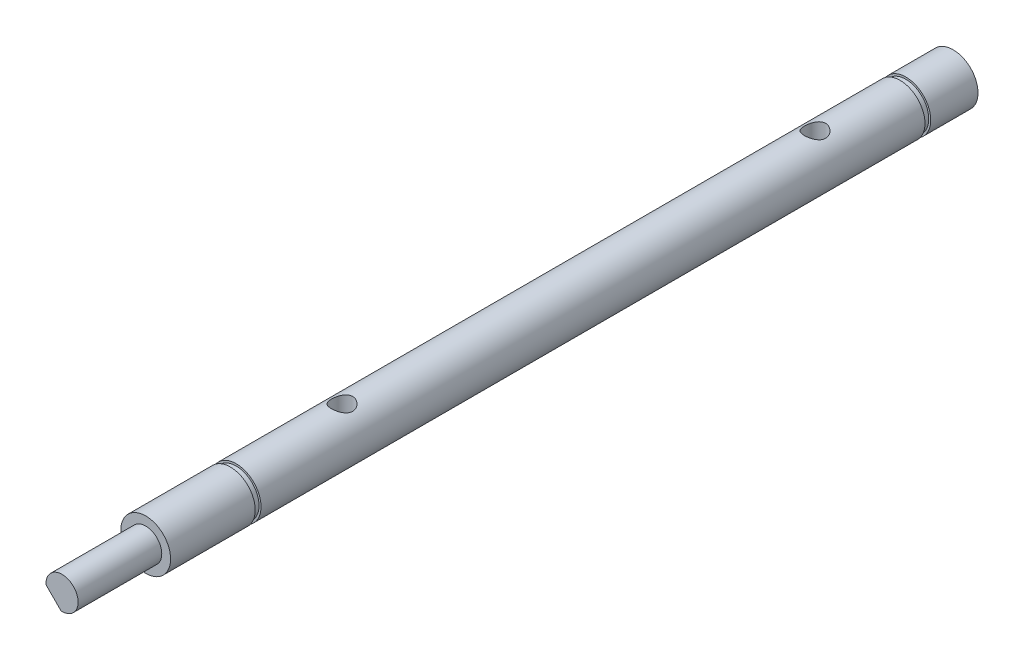
ISO-10303-21;
HEADER;
FILE_DESCRIPTION(('STEP AP214'),'2;1');
FILE_NAME('part.step','',(''),(''),'','','');
FILE_SCHEMA(('AUTOMOTIVE_DESIGN { 1 0 10303 214 1 1 1 1 }'));
ENDSEC;
DATA;
#1=APPLICATION_CONTEXT('core data for automotive mechanical design processes');
#2=APPLICATION_PROTOCOL_DEFINITION('international standard','automotive_design',2000,#1);
#3=PRODUCT_CONTEXT('',#1,'mechanical');
#4=PRODUCT('Part','Part','',(#3));
#5=PRODUCT_RELATED_PRODUCT_CATEGORY('part','',(#4));
#6=PRODUCT_DEFINITION_FORMATION('','',#4);
#7=PRODUCT_DEFINITION_CONTEXT('part definition',#1,'design');
#8=PRODUCT_DEFINITION('design','',#6,#7);
#9=PRODUCT_DEFINITION_SHAPE('','',#8);
#10=(LENGTH_UNIT() NAMED_UNIT(*) SI_UNIT(.MILLI.,.METRE.));
#11=(NAMED_UNIT(*) PLANE_ANGLE_UNIT() SI_UNIT($,.RADIAN.));
#12=(NAMED_UNIT(*) SI_UNIT($,.STERADIAN.) SOLID_ANGLE_UNIT());
#13=UNCERTAINTY_MEASURE_WITH_UNIT(LENGTH_MEASURE(1.E-05),#10,'distance_accuracy_value','');
#14=(GEOMETRIC_REPRESENTATION_CONTEXT(3) GLOBAL_UNCERTAINTY_ASSIGNED_CONTEXT((#13)) GLOBAL_UNIT_ASSIGNED_CONTEXT((#10,
#11,#12)) REPRESENTATION_CONTEXT('',''));
#15=CARTESIAN_POINT('',(0.,0.,0.));
#16=DIRECTION('',(0.,0.,1.));
#17=DIRECTION('',(1.,0.,0.));
#18=AXIS2_PLACEMENT_3D('',#15,#16,#17);
#19=CARTESIAN_POINT('',(-35.5331378268646,0.,13.843));
#20=DIRECTION('',(0.,0.,1.));
#21=DIRECTION('',(1.,0.,0.));
#22=AXIS2_PLACEMENT_3D('',#19,#20,#21);
#23=CYLINDRICAL_SURFACE('',#22,3.175);
#24=CARTESIAN_POINT('',(-35.5331378268646,-3.17500000000001,-83.5361541101905));
#25=CARTESIAN_POINT('',(-35.4608258465463,-3.17499376427411,-83.5361458853937));
#26=CARTESIAN_POINT('',(-35.3884074708951,-3.17250122265996,-83.5303208810433));
#27=CARTESIAN_POINT('',(-35.2456295737952,-3.16277066799622,-83.5072311196538));
#28=CARTESIAN_POINT('',(-35.1752757657073,-3.15552058505164,-83.4899372649224));
#29=CARTESIAN_POINT('',(-35.0389288869422,-3.13705242394938,-83.4446706315388));
#30=CARTESIAN_POINT('',(-34.9729216851781,-3.12584804282756,-83.4167346891297));
#31=CARTESIAN_POINT('',(-34.8465970192275,-3.1005551810215,-83.3511324234816));
#32=CARTESIAN_POINT('',(-34.7862779804942,-3.0864675019097,-83.3134688038288));
#33=CARTESIAN_POINT('',(-34.669807205311,-3.05599084668588,-83.2274146325406));
#34=CARTESIAN_POINT('',(-34.6139897838708,-3.03952431771545,-83.1785993328251));
#35=CARTESIAN_POINT('',(-34.5110440271247,-3.00647271455962,-83.0725266464288));
#36=CARTESIAN_POINT('',(-34.4639204609107,-2.98988758046311,-83.0152646570495));
#37=CARTESIAN_POINT('',(-34.3772759403605,-2.95750917471473,-82.890320255909));
#38=CARTESIAN_POINT('',(-34.3382773780979,-2.94180185247632,-82.8222509493234));
#39=CARTESIAN_POINT('',(-34.2724328289807,-2.91419493098839,-82.6797543259549));
#40=CARTESIAN_POINT('',(-34.245580303087,-2.90229328389849,-82.6053304559847));
#41=CARTESIAN_POINT('',(-34.2061864551322,-2.88448854081884,-82.4560858922888));
#42=CARTESIAN_POINT('',(-34.1930001610563,-2.87831670118837,-82.3814687766833));
#43=CARTESIAN_POINT('',(-34.1793027701837,-2.87190163928983,-82.2308455212675));
#44=CARTESIAN_POINT('',(-34.1787842195909,-2.87165493063135,-82.1548402246248));
#45=CARTESIAN_POINT('',(-34.1899528680395,-2.87689162283201,-82.0101605723525));
#46=CARTESIAN_POINT('',(-34.2006569549422,-2.88191351336427,-81.9413901994606));
#47=CARTESIAN_POINT('',(-34.2323123386599,-2.89633861211709,-81.8067351310634));
#48=CARTESIAN_POINT('',(-34.2532657046312,-2.9057427050121,-81.7408510211734));
#49=CARTESIAN_POINT('',(-34.3052369531808,-2.92808748949867,-81.6121368326237));
#50=CARTESIAN_POINT('',(-34.3364635049763,-2.94110054344016,-81.5494041384309));
#51=CARTESIAN_POINT('',(-34.4079464487757,-2.96918199373292,-81.4298178843847));
#52=CARTESIAN_POINT('',(-34.4482064891825,-2.98425121955487,-81.3729667135256));
#53=CARTESIAN_POINT('',(-34.5408038769364,-3.01637253593643,-81.2614482236268));
#54=CARTESIAN_POINT('',(-34.5938958318252,-3.0334819320518,-81.2074221580887));
#55=CARTESIAN_POINT('',(-34.7085479876994,-3.06663259637419,-81.1088196385918));
#56=CARTESIAN_POINT('',(-34.7701103477964,-3.08267359069276,-81.0642456013462));
#57=CARTESIAN_POINT('',(-34.9019798282604,-3.11238486879189,-80.9848132928089));
#58=CARTESIAN_POINT('',(-34.9724677623041,-3.12598548270222,-80.9502271915684));
#59=CARTESIAN_POINT('',(-35.1189892299383,-3.14874388156017,-80.8936311526974));
#60=CARTESIAN_POINT('',(-35.1950195274191,-3.15790423558694,-80.8716139415496));
#61=CARTESIAN_POINT('',(-35.3451183745293,-3.17026332558043,-80.8421490295315));
#62=CARTESIAN_POINT('',(-35.4189892089949,-3.17381325962292,-80.833841454889));
#63=CARTESIAN_POINT('',(-35.5671492550794,-3.17568105366637,-80.8294540369906));
#64=CARTESIAN_POINT('',(-35.6414383327188,-3.17400050350427,-80.8333704781729));
#65=CARTESIAN_POINT('',(-35.78422419281,-3.16582243599865,-80.8527145501664));
#66=CARTESIAN_POINT('',(-35.8528205452816,-3.15958185757468,-80.867528442903));
#67=CARTESIAN_POINT('',(-35.9864729421111,-3.14319082038793,-80.9073816774549));
#68=CARTESIAN_POINT('',(-36.0515285432473,-3.13303987341454,-80.9324222961032));
#69=CARTESIAN_POINT('',(-36.1785486189836,-3.10940117061925,-80.9928324368617));
#70=CARTESIAN_POINT('',(-36.240353286235,-3.0958191739096,-81.0284998899359));
#71=CARTESIAN_POINT('',(-36.3573227066593,-3.06675439613932,-81.1088251462745));
#72=CARTESIAN_POINT('',(-36.412484621555,-3.05127080824472,-81.1534867708905));
#73=CARTESIAN_POINT('',(-36.5189286055891,-3.01863676563667,-81.2544217129391));
#74=CARTESIAN_POINT('',(-36.569615057641,-3.00144808863403,-81.3113123846377));
#75=CARTESIAN_POINT('',(-36.6608990537127,-2.96835692538156,-81.4330471338792));
#76=CARTESIAN_POINT('',(-36.7014939080959,-2.95245478278206,-81.4978933248829));
#77=CARTESIAN_POINT('',(-36.7719959554591,-2.92358303045919,-81.6352616842834));
#78=CARTESIAN_POINT('',(-36.8017083479671,-2.91066826625578,-81.7078962275471));
#79=CARTESIAN_POINT('',(-36.8482171068941,-2.88995701757538,-81.8578634695168));
#80=CARTESIAN_POINT('',(-36.865024777199,-2.88215605454429,-81.9351919923063));
#81=CARTESIAN_POINT('',(-36.8840999877546,-2.87326066425686,-82.0857130937064));
#82=CARTESIAN_POINT('',(-36.8874194967548,-2.87168133184629,-82.1587441892723));
#83=CARTESIAN_POINT('',(-36.8822584965445,-2.87410980516819,-82.304285747412));
#84=CARTESIAN_POINT('',(-36.8737800065305,-2.8781166548405,-82.3767962969411));
#85=CARTESIAN_POINT('',(-36.8461603791058,-2.89081435572086,-82.5154285504303));
#86=CARTESIAN_POINT('',(-36.8275833429974,-2.89925667251006,-82.5816876365108));
#87=CARTESIAN_POINT('',(-36.7808595776859,-2.91966810669132,-82.710156511446));
#88=CARTESIAN_POINT('',(-36.7527101345619,-2.93163822413925,-82.7723651459711));
#89=CARTESIAN_POINT('',(-36.68564819358,-2.95866974170817,-82.8951535661335));
#90=CARTESIAN_POINT('',(-36.6461796054681,-2.9738761215368,-82.9553970865907));
#91=CARTESIAN_POINT('',(-36.5583595018584,-3.00528179589944,-83.06873461292));
#92=CARTESIAN_POINT('',(-36.5100046871307,-3.02148145772031,-83.1218259506387));
#93=CARTESIAN_POINT('',(-36.4013376869132,-3.05455722211636,-83.2235949357091));
#94=CARTESIAN_POINT('',(-36.3403889230099,-3.07138832065965,-83.2716107536678));
#95=CARTESIAN_POINT('',(-36.2106848598122,-3.10257916482517,-83.3567786895932));
#96=CARTESIAN_POINT('',(-36.1419260393688,-3.11693778833813,-83.3939258802558));
#97=CARTESIAN_POINT('',(-35.9994870715847,-3.14138312017249,-83.45554879584));
#98=CARTESIAN_POINT('',(-35.9258964286999,-3.15153079407948,-83.480206588307));
#99=CARTESIAN_POINT('',(-35.7752161107187,-3.16665584269732,-83.5165545078877));
#100=CARTESIAN_POINT('',(-35.6981380843486,-3.17164926980854,-83.5282849038896));
#101=CARTESIAN_POINT('',(-35.5915391547414,-3.17459936321147,-83.5352116684735));
#102=CARTESIAN_POINT('',(-35.562347170722,-3.1750025188283,-83.5361574324743));
#103=CARTESIAN_POINT('',(-35.5331378268646,-3.17500000000001,-83.5361541101905));
#104=B_SPLINE_CURVE_WITH_KNOTS('',3,(#24,#25,#26,#27,#28,#29,#30,#31,#32,#33,#34,#35,#36,#37,
#38,#39,#40,#41,#42,#43,#44,#45,#46,#47,#48,#49,#50,#51,#52,#53,#54,#55,#56,#57,#58,#59,#60,#61,
#62,#63,#64,#65,#66,#67,#68,#69,#70,#71,#72,#73,#74,#75,#76,#77,#78,#79,#80,#81,#82,#83,#84,#85,
#86,#87,#88,#89,#90,#91,#92,#93,#94,#95,#96,#97,#98,#99,#100,#101,#102,#103),.UNSPECIFIED.,.T.,
.F.,(4,2,2,2,2,2,2,2,2,2,2,2,2,2,2,2,2,2,2,2,2,2,2,2,2,2,2,2,2,2,2,2,2,2,2,2,2,2,2,4),(0.,
0.216850050638948,0.434252388523417,0.650908954368244,0.867505370130757,1.09439609589245,
1.32141091689532,1.56022386511507,1.79890809057365,2.02572902648838,2.25241649603317,
2.46078251280766,2.66919061253202,2.88212426261051,3.09514406662219,3.32706321416166,
3.55904158793931,3.79684693152946,4.03451451918153,4.25661426582134,4.47864651050856,
4.68904802527594,4.89947581724861,5.11647002970504,5.33355663169251,5.56682347195768,
5.80015241655902,6.03747459229674,6.27458864785541,6.49280702774576,6.71098806472668,
6.91807492424943,7.12522054501708,7.34512352029498,7.56510830550798,7.80215736760158,
8.03931373022254,8.27290548905707,8.5057675337372,8.59336087119989),.UNSPECIFIED.);
#105=CARTESIAN_POINT('',(-35.5331378268646,-3.17500000000001,-83.5361541101905));
#106=VERTEX_POINT('',#105);
#107=EDGE_CURVE('E11',#106,#106,#104,.T.);
#108=ORIENTED_EDGE('',*,*,#107,.F.);
#109=EDGE_LOOP('',(#108));
#110=FACE_BOUND('',#109,.T.);
#111=CARTESIAN_POINT('',(-35.5331378268646,3.175,-83.5361541101905));
#112=CARTESIAN_POINT('',(-35.6054498071829,3.17499376427411,-83.5361458853937));
#113=CARTESIAN_POINT('',(-35.677868182834,3.17250122265996,-83.5303208810433));
#114=CARTESIAN_POINT('',(-35.8206460799339,3.16277066799622,-83.5072311196538));
#115=CARTESIAN_POINT('',(-35.8909998880218,3.15552058505164,-83.4899372649224));
#116=CARTESIAN_POINT('',(-36.0273467667869,3.13705242394938,-83.4446706315388));
#117=CARTESIAN_POINT('',(-36.093353968551,3.12584804282756,-83.4167346891297));
#118=CARTESIAN_POINT('',(-36.2196786345016,3.1005551810215,-83.3511324234816));
#119=CARTESIAN_POINT('',(-36.2799976732349,3.0864675019097,-83.3134688038288));
#120=CARTESIAN_POINT('',(-36.3964684484181,3.05599084668588,-83.2274146325406));
#121=CARTESIAN_POINT('',(-36.4522858698583,3.03952431771545,-83.1785993328251));
#122=CARTESIAN_POINT('',(-36.5552316266044,3.00647271455962,-83.0725266464288));
#123=CARTESIAN_POINT('',(-36.6023551928184,2.98988758046311,-83.0152646570495));
#124=CARTESIAN_POINT('',(-36.6889997133686,2.95750917471473,-82.890320255909));
#125=CARTESIAN_POINT('',(-36.7279982756312,2.94180185247632,-82.8222509493234));
#126=CARTESIAN_POINT('',(-36.7938428247484,2.91419493098839,-82.6797543259549));
#127=CARTESIAN_POINT('',(-36.8206953506421,2.90229328389849,-82.6053304559847));
#128=CARTESIAN_POINT('',(-36.8600891985969,2.88448854081884,-82.4560858922888));
#129=CARTESIAN_POINT('',(-36.8732754926728,2.87831670118837,-82.3814687766833));
#130=CARTESIAN_POINT('',(-36.8869728835454,2.87190163928983,-82.2308455212675));
#131=CARTESIAN_POINT('',(-36.8874914341382,2.87165493063135,-82.1548402246248));
#132=CARTESIAN_POINT('',(-36.8763227856896,2.87689162283201,-82.0101605723525));
#133=CARTESIAN_POINT('',(-36.8656186987869,2.88191351336427,-81.9413901994606));
#134=CARTESIAN_POINT('',(-36.8339633150692,2.89633861211709,-81.8067351310634));
#135=CARTESIAN_POINT('',(-36.8130099490979,2.9057427050121,-81.7408510211734));
#136=CARTESIAN_POINT('',(-36.7610387005483,2.92808748949867,-81.6121368326237));
#137=CARTESIAN_POINT('',(-36.7298121487528,2.94110054344016,-81.5494041384309));
#138=CARTESIAN_POINT('',(-36.6583292049534,2.96918199373292,-81.4298178843847));
#139=CARTESIAN_POINT('',(-36.6180691645466,2.98425121955487,-81.3729667135256));
#140=CARTESIAN_POINT('',(-36.5254717767927,3.01637253593643,-81.2614482236268));
#141=CARTESIAN_POINT('',(-36.4723798219039,3.0334819320518,-81.2074221580887));
#142=CARTESIAN_POINT('',(-36.3577276660297,3.06663259637419,-81.1088196385918));
#143=CARTESIAN_POINT('',(-36.2961653059327,3.08267359069276,-81.0642456013462));
#144=CARTESIAN_POINT('',(-36.1642958254687,3.11238486879189,-80.9848132928089));
#145=CARTESIAN_POINT('',(-36.093807891425,3.12598548270222,-80.9502271915684));
#146=CARTESIAN_POINT('',(-35.9472864237909,3.14874388156017,-80.8936311526974));
#147=CARTESIAN_POINT('',(-35.87125612631,3.15790423558694,-80.8716139415496));
#148=CARTESIAN_POINT('',(-35.7211572791999,3.17026332558043,-80.8421490295315));
#149=CARTESIAN_POINT('',(-35.6472864447342,3.17381325962292,-80.833841454889));
#150=CARTESIAN_POINT('',(-35.4991263986497,3.17568105366637,-80.8294540369906));
#151=CARTESIAN_POINT('',(-35.4248373210103,3.17400050350427,-80.8333704781729));
#152=CARTESIAN_POINT('',(-35.2820514609191,3.16582243599865,-80.8527145501664));
#153=CARTESIAN_POINT('',(-35.2134551084475,3.15958185757468,-80.867528442903));
#154=CARTESIAN_POINT('',(-35.079802711618,3.14319082038793,-80.9073816774549));
#155=CARTESIAN_POINT('',(-35.0147471104818,3.13303987341454,-80.9324222961032));
#156=CARTESIAN_POINT('',(-34.8877270347456,3.10940117061925,-80.9928324368617));
#157=CARTESIAN_POINT('',(-34.8259223674941,3.0958191739096,-81.0284998899359));
#158=CARTESIAN_POINT('',(-34.7089529470698,3.06675439613932,-81.1088251462745));
#159=CARTESIAN_POINT('',(-34.6537910321741,3.05127080824472,-81.1534867708905));
#160=CARTESIAN_POINT('',(-34.54734704814,3.01863676563667,-81.2544217129391));
#161=CARTESIAN_POINT('',(-34.4966605960881,3.00144808863403,-81.3113123846377));
#162=CARTESIAN_POINT('',(-34.4053766000164,2.96835692538156,-81.4330471338792));
#163=CARTESIAN_POINT('',(-34.3647817456332,2.95245478278206,-81.4978933248829));
#164=CARTESIAN_POINT('',(-34.29427969827,2.92358303045919,-81.6352616842834));
#165=CARTESIAN_POINT('',(-34.264567305762,2.91066826625578,-81.7078962275471));
#166=CARTESIAN_POINT('',(-34.218058546835,2.88995701757538,-81.8578634695168));
#167=CARTESIAN_POINT('',(-34.2012508765301,2.88215605454429,-81.9351919923063));
#168=CARTESIAN_POINT('',(-34.1821756659745,2.87326066425686,-82.0857130937064));
#169=CARTESIAN_POINT('',(-34.1788561569743,2.87168133184629,-82.1587441892723));
#170=CARTESIAN_POINT('',(-34.1840171571846,2.87410980516819,-82.304285747412));
#171=CARTESIAN_POINT('',(-34.1924956471986,2.8781166548405,-82.3767962969411));
#172=CARTESIAN_POINT('',(-34.2201152746233,2.89081435572086,-82.5154285504303));
#173=CARTESIAN_POINT('',(-34.2386923107317,2.89925667251006,-82.5816876365108));
#174=CARTESIAN_POINT('',(-34.2854160760432,2.91966810669132,-82.710156511446));
#175=CARTESIAN_POINT('',(-34.3135655191672,2.93163822413925,-82.7723651459711));
#176=CARTESIAN_POINT('',(-34.3806274601491,2.95866974170817,-82.8951535661335));
#177=CARTESIAN_POINT('',(-34.420096048261,2.9738761215368,-82.9553970865907));
#178=CARTESIAN_POINT('',(-34.5079161518707,3.00528179589944,-83.06873461292));
#179=CARTESIAN_POINT('',(-34.5562709665985,3.02148145772031,-83.1218259506387));
#180=CARTESIAN_POINT('',(-34.6649379668159,3.05455722211636,-83.2235949357091));
#181=CARTESIAN_POINT('',(-34.7258867307192,3.07138832065965,-83.2716107536678));
#182=CARTESIAN_POINT('',(-34.8555907939169,3.10257916482517,-83.3567786895932));
#183=CARTESIAN_POINT('',(-34.9243496143603,3.11693778833813,-83.3939258802558));
#184=CARTESIAN_POINT('',(-35.0667885821444,3.14138312017248,-83.45554879584));
#185=CARTESIAN_POINT('',(-35.1403792250292,3.15153079407948,-83.480206588307));
#186=CARTESIAN_POINT('',(-35.2910595430104,3.16665584269732,-83.5165545078877));
#187=CARTESIAN_POINT('',(-35.3681375693805,3.17164926980854,-83.5282849038896));
#188=CARTESIAN_POINT('',(-35.4747364989878,3.17459936321147,-83.5352116684735));
#189=CARTESIAN_POINT('',(-35.5039284830071,3.1750025188283,-83.5361574324743));
#190=CARTESIAN_POINT('',(-35.5331378268646,3.175,-83.5361541101905));
#191=B_SPLINE_CURVE_WITH_KNOTS('',3,(#111,#112,#113,#114,#115,#116,#117,#118,#119,#120,#121,
#122,#123,#124,#125,#126,#127,#128,#129,#130,#131,#132,#133,#134,#135,#136,#137,#138,#139,#140,
#141,#142,#143,#144,#145,#146,#147,#148,#149,#150,#151,#152,#153,#154,#155,#156,#157,#158,#159,
#160,#161,#162,#163,#164,#165,#166,#167,#168,#169,#170,#171,#172,#173,#174,#175,#176,#177,#178,
#179,#180,#181,#182,#183,#184,#185,#186,#187,#188,#189,#190),.UNSPECIFIED.,.T.,.F.,(4,2,2,2,2,2,
2,2,2,2,2,2,2,2,2,2,2,2,2,2,2,2,2,2,2,2,2,2,2,2,2,2,2,2,2,2,2,2,2,4),(0.,0.216850050638948,
0.434252388523417,0.650908954368244,0.867505370130757,1.09439609589245,1.32141091689532,
1.56022386511507,1.79890809057365,2.02572902648838,2.25241649603317,2.46078251280766,
2.66919061253202,2.88212426261051,3.09514406662219,3.32706321416166,3.55904158793931,
3.79684693152946,4.03451451918153,4.25661426582134,4.47864651050856,4.68904802527594,
4.89947581724861,5.11647002970504,5.33355663169251,5.56682347195768,5.80015241655902,
6.03747459229674,6.27458864785541,6.49280702774576,6.71098806472668,6.91807492424943,
7.12522054501708,7.34512352029498,7.56510830550798,7.80215736760158,8.03931373022254,
8.27290548905706,8.5057675337372,8.59336087119988),.UNSPECIFIED.);
#192=CARTESIAN_POINT('',(-35.5331378268646,3.175,-83.5361541101905));
#193=VERTEX_POINT('',#192);
#194=EDGE_CURVE('E77',#193,#193,#191,.T.);
#195=ORIENTED_EDGE('',*,*,#194,.F.);
#196=EDGE_LOOP('',(#195));
#197=FACE_BOUND('',#196,.T.);
#198=CARTESIAN_POINT('',(-35.5331378268646,-3.17500000000001,-23.2111541101903));
#199=CARTESIAN_POINT('',(-35.4608258465463,-3.17499376427411,-23.2111458853935));
#200=CARTESIAN_POINT('',(-35.3884074708951,-3.17250122265996,-23.2053208810431));
#201=CARTESIAN_POINT('',(-35.2456295737952,-3.16277066799622,-23.1822311196536));
#202=CARTESIAN_POINT('',(-35.1752757657073,-3.15552058505164,-23.1649372649222));
#203=CARTESIAN_POINT('',(-35.0389288869422,-3.13705242394938,-23.1196706315386));
#204=CARTESIAN_POINT('',(-34.9729216851781,-3.12584804282756,-23.0917346891296));
#205=CARTESIAN_POINT('',(-34.8465970192275,-3.1005551810215,-23.0261324234814));
#206=CARTESIAN_POINT('',(-34.7862779804942,-3.0864675019097,-22.9884688038286));
#207=CARTESIAN_POINT('',(-34.669807205311,-3.05599084668588,-22.9024146325404));
#208=CARTESIAN_POINT('',(-34.6139897838708,-3.03952431771545,-22.8535993328249));
#209=CARTESIAN_POINT('',(-34.5110440271247,-3.00647271455962,-22.7475266464286));
#210=CARTESIAN_POINT('',(-34.4639204609107,-2.98988758046312,-22.6902646570493));
#211=CARTESIAN_POINT('',(-34.3772759403605,-2.95750917471473,-22.5653202559089));
#212=CARTESIAN_POINT('',(-34.3382773780979,-2.94180185247633,-22.4972509493232));
#213=CARTESIAN_POINT('',(-34.2724328289807,-2.91419493098839,-22.3547543259548));
#214=CARTESIAN_POINT('',(-34.245580303087,-2.90229328389849,-22.2803304559845));
#215=CARTESIAN_POINT('',(-34.2061864551322,-2.88448854081884,-22.1310858922886));
#216=CARTESIAN_POINT('',(-34.1930001610563,-2.87831670118837,-22.0564687766831));
#217=CARTESIAN_POINT('',(-34.1793027701837,-2.87190163928982,-21.9058455212673));
#218=CARTESIAN_POINT('',(-34.1787842195909,-2.87165493063134,-21.8298402246246));
#219=CARTESIAN_POINT('',(-34.1899528680395,-2.876891622832,-21.6851605723523));
#220=CARTESIAN_POINT('',(-34.2006569549422,-2.88191351336426,-21.6163901994604));
#221=CARTESIAN_POINT('',(-34.2323123386599,-2.89633861211709,-21.4817351310633));
#222=CARTESIAN_POINT('',(-34.2532657046312,-2.9057427050121,-21.4158510211733));
#223=CARTESIAN_POINT('',(-34.3052369531808,-2.92808748949866,-21.2871368326235));
#224=CARTESIAN_POINT('',(-34.3364635049763,-2.94110054344015,-21.2244041384308));
#225=CARTESIAN_POINT('',(-34.4079464487757,-2.96918199373291,-21.1048178843845));
#226=CARTESIAN_POINT('',(-34.4482064891825,-2.98425121955487,-21.0479667135254));
#227=CARTESIAN_POINT('',(-34.5408038769364,-3.01637253593643,-20.9364482236266));
#228=CARTESIAN_POINT('',(-34.5938958318252,-3.0334819320518,-20.8824221580885));
#229=CARTESIAN_POINT('',(-34.7085479876994,-3.06663259637418,-20.7838196385916));
#230=CARTESIAN_POINT('',(-34.7701103477964,-3.08267359069276,-20.739245601346));
#231=CARTESIAN_POINT('',(-34.9019798282604,-3.11238486879189,-20.6598132928087));
#232=CARTESIAN_POINT('',(-34.9724677623041,-3.12598548270222,-20.6252271915682));
#233=CARTESIAN_POINT('',(-35.1189892299382,-3.14874388156017,-20.5686311526972));
#234=CARTESIAN_POINT('',(-35.1950195274191,-3.15790423558693,-20.5466139415494));
#235=CARTESIAN_POINT('',(-35.3451183745292,-3.17026332558043,-20.5171490295313));
#236=CARTESIAN_POINT('',(-35.4189892089949,-3.17381325962292,-20.5088414548889));
#237=CARTESIAN_POINT('',(-35.5671492550794,-3.17568105366637,-20.5044540369904));
#238=CARTESIAN_POINT('',(-35.6414383327188,-3.17400050350427,-20.5083704781727));
#239=CARTESIAN_POINT('',(-35.78422419281,-3.16582243599865,-20.5277145501662));
#240=CARTESIAN_POINT('',(-35.8528205452816,-3.15958185757468,-20.5425284429029));
#241=CARTESIAN_POINT('',(-35.9864729421111,-3.14319082038793,-20.5823816774547));
#242=CARTESIAN_POINT('',(-36.0515285432473,-3.13303987341455,-20.607422296103));
#243=CARTESIAN_POINT('',(-36.1785486189835,-3.10940117061926,-20.6678324368615));
#244=CARTESIAN_POINT('',(-36.240353286235,-3.0958191739096,-20.7034998899357));
#245=CARTESIAN_POINT('',(-36.3573227066593,-3.06675439613932,-20.7838251462743));
#246=CARTESIAN_POINT('',(-36.412484621555,-3.05127080824472,-20.8284867708903));
#247=CARTESIAN_POINT('',(-36.5189286055891,-3.01863676563667,-20.9294217129389));
#248=CARTESIAN_POINT('',(-36.569615057641,-3.00144808863403,-20.9863123846375));
#249=CARTESIAN_POINT('',(-36.6608990537127,-2.96835692538156,-21.108047133879));
#250=CARTESIAN_POINT('',(-36.7014939080959,-2.95245478278207,-21.1728933248827));
#251=CARTESIAN_POINT('',(-36.7719959554591,-2.92358303045919,-21.3102616842832));
#252=CARTESIAN_POINT('',(-36.8017083479671,-2.91066826625579,-21.3828962275469));
#253=CARTESIAN_POINT('',(-36.8482171068941,-2.88995701757538,-21.5328634695166));
#254=CARTESIAN_POINT('',(-36.865024777199,-2.88215605454429,-21.6101919923061));
#255=CARTESIAN_POINT('',(-36.8840999877546,-2.87326066425686,-21.7607130937063));
#256=CARTESIAN_POINT('',(-36.8874194967548,-2.87168133184629,-21.8337441892722));
#257=CARTESIAN_POINT('',(-36.8822584965445,-2.8741098051682,-21.9792857474118));
#258=CARTESIAN_POINT('',(-36.8737800065305,-2.8781166548405,-22.0517962969409));
#259=CARTESIAN_POINT('',(-36.8461603791058,-2.89081435572086,-22.1904285504301));
#260=CARTESIAN_POINT('',(-36.8275833429974,-2.89925667251007,-22.2566876365106));
#261=CARTESIAN_POINT('',(-36.7808595776859,-2.91966810669133,-22.3851565114458));
#262=CARTESIAN_POINT('',(-36.7527101345619,-2.93163822413925,-22.4473651459709));
#263=CARTESIAN_POINT('',(-36.68564819358,-2.95866974170817,-22.5701535661333));
#264=CARTESIAN_POINT('',(-36.6461796054681,-2.9738761215368,-22.6303970865905));
#265=CARTESIAN_POINT('',(-36.5583595018584,-3.00528179589944,-22.7437346129198));
#266=CARTESIAN_POINT('',(-36.5100046871306,-3.02148145772031,-22.7968259506385));
#267=CARTESIAN_POINT('',(-36.4013376869132,-3.05455722211637,-22.8985949357089));
#268=CARTESIAN_POINT('',(-36.3403889230099,-3.07138832065965,-22.9466107536676));
#269=CARTESIAN_POINT('',(-36.2106848598122,-3.10257916482517,-23.0317786895931));
#270=CARTESIAN_POINT('',(-36.1419260393688,-3.11693778833813,-23.0689258802556));
#271=CARTESIAN_POINT('',(-35.9994870715847,-3.14138312017249,-23.1305487958398));
#272=CARTESIAN_POINT('',(-35.9258964286999,-3.15153079407948,-23.1552065883068));
#273=CARTESIAN_POINT('',(-35.7752161107187,-3.16665584269732,-23.1915545078875));
#274=CARTESIAN_POINT('',(-35.6981380843486,-3.17164926980854,-23.2032849038894));
#275=CARTESIAN_POINT('',(-35.5915391547414,-3.17459936321147,-23.2102116684733));
#276=CARTESIAN_POINT('',(-35.562347170722,-3.1750025188283,-23.2111574324741));
#277=CARTESIAN_POINT('',(-35.5331378268646,-3.17500000000001,-23.2111541101903));
#278=B_SPLINE_CURVE_WITH_KNOTS('',3,(#198,#199,#200,#201,#202,#203,#204,#205,#206,#207,#208,
#209,#210,#211,#212,#213,#214,#215,#216,#217,#218,#219,#220,#221,#222,#223,#224,#225,#226,#227,
#228,#229,#230,#231,#232,#233,#234,#235,#236,#237,#238,#239,#240,#241,#242,#243,#244,#245,#246,
#247,#248,#249,#250,#251,#252,#253,#254,#255,#256,#257,#258,#259,#260,#261,#262,#263,#264,#265,
#266,#267,#268,#269,#270,#271,#272,#273,#274,#275,#276,#277),.UNSPECIFIED.,.T.,.F.,(4,2,2,2,2,2,
2,2,2,2,2,2,2,2,2,2,2,2,2,2,2,2,2,2,2,2,2,2,2,2,2,2,2,2,2,2,2,2,2,4),(0.,0.216850050638949,
0.434252388523416,0.650908954368245,0.867505370130756,1.09439609589244,1.32141091689531,
1.56022386511506,1.79890809057364,2.02572902648838,2.25241649603316,2.46078251280766,
2.66919061253203,2.88212426261051,3.09514406662218,3.32706321416165,3.5590415879393,
3.79684693152946,4.03451451918153,4.25661426582134,4.47864651050856,4.68904802527594,
4.89947581724861,5.11647002970505,5.33355663169251,5.5668234719577,5.800152416559,
6.03747459229673,6.27458864785542,6.49280702774577,6.71098806472668,6.91807492424943,
7.12522054501708,7.34512352029499,7.56510830550799,7.8021573676016,8.03931373022255,
8.27290548905706,8.50576753373721,8.59336087119989),.UNSPECIFIED.);
#279=CARTESIAN_POINT('',(-35.5331378268646,-3.17500000000001,-23.2111541101903));
#280=VERTEX_POINT('',#279);
#281=EDGE_CURVE('E47',#280,#280,#278,.T.);
#282=ORIENTED_EDGE('',*,*,#281,.F.);
#283=EDGE_LOOP('',(#282));
#284=FACE_BOUND('',#283,.T.);
#285=CARTESIAN_POINT('',(-35.5331378268645,3.175,-23.2111541101903));
#286=CARTESIAN_POINT('',(-35.6054498071828,3.17499376427411,-23.2111458853935));
#287=CARTESIAN_POINT('',(-35.677868182834,3.17250122265996,-23.2053208810431));
#288=CARTESIAN_POINT('',(-35.8206460799339,3.16277066799622,-23.1822311196536));
#289=CARTESIAN_POINT('',(-35.8909998880218,3.15552058505165,-23.1649372649222));
#290=CARTESIAN_POINT('',(-36.0273467667869,3.13705242394938,-23.1196706315386));
#291=CARTESIAN_POINT('',(-36.093353968551,3.12584804282756,-23.0917346891296));
#292=CARTESIAN_POINT('',(-36.2196786345016,3.10055518102151,-23.0261324234814));
#293=CARTESIAN_POINT('',(-36.2799976732349,3.08646750190971,-22.9884688038286));
#294=CARTESIAN_POINT('',(-36.3964684484181,3.05599084668589,-22.9024146325405));
#295=CARTESIAN_POINT('',(-36.4522858698583,3.03952431771545,-22.8535993328249));
#296=CARTESIAN_POINT('',(-36.5552316266044,3.00647271455962,-22.7475266464286));
#297=CARTESIAN_POINT('',(-36.6023551928184,2.98988758046312,-22.6902646570493));
#298=CARTESIAN_POINT('',(-36.6889997133686,2.95750917471474,-22.5653202559089));
#299=CARTESIAN_POINT('',(-36.7279982756312,2.94180185247633,-22.4972509493232));
#300=CARTESIAN_POINT('',(-36.7938428247484,2.9141949309884,-22.3547543259548));
#301=CARTESIAN_POINT('',(-36.8206953506421,2.9022932838985,-22.2803304559845));
#302=CARTESIAN_POINT('',(-36.8600891985969,2.88448854081885,-22.1310858922886));
#303=CARTESIAN_POINT('',(-36.8732754926728,2.87831670118837,-22.0564687766831));
#304=CARTESIAN_POINT('',(-36.8869728835454,2.87190163928983,-21.9058455212673));
#305=CARTESIAN_POINT('',(-36.8874914341382,2.87165493063135,-21.8298402246246));
#306=CARTESIAN_POINT('',(-36.8763227856896,2.87689162283201,-21.6851605723523));
#307=CARTESIAN_POINT('',(-36.8656186987869,2.88191351336427,-21.6163901994604));
#308=CARTESIAN_POINT('',(-36.8339633150692,2.8963386121171,-21.4817351310633));
#309=CARTESIAN_POINT('',(-36.8130099490979,2.9057427050121,-21.4158510211733));
#310=CARTESIAN_POINT('',(-36.7610387005483,2.92808748949867,-21.2871368326235));
#311=CARTESIAN_POINT('',(-36.7298121487528,2.94110054344016,-21.2244041384308));
#312=CARTESIAN_POINT('',(-36.6583292049534,2.96918199373292,-21.1048178843845));
#313=CARTESIAN_POINT('',(-36.6180691645466,2.98425121955487,-21.0479667135254));
#314=CARTESIAN_POINT('',(-36.5254717767927,3.01637253593643,-20.9364482236266));
#315=CARTESIAN_POINT('',(-36.4723798219039,3.0334819320518,-20.8824221580885));
#316=CARTESIAN_POINT('',(-36.3577276660297,3.06663259637419,-20.7838196385916));
#317=CARTESIAN_POINT('',(-36.2961653059327,3.08267359069276,-20.739245601346));
#318=CARTESIAN_POINT('',(-36.1642958254687,3.11238486879189,-20.6598132928087));
#319=CARTESIAN_POINT('',(-36.093807891425,3.12598548270222,-20.6252271915682));
#320=CARTESIAN_POINT('',(-35.9472864237909,3.14874388156017,-20.5686311526972));
#321=CARTESIAN_POINT('',(-35.87125612631,3.15790423558694,-20.5466139415494));
#322=CARTESIAN_POINT('',(-35.7211572791999,3.17026332558043,-20.5171490295313));
#323=CARTESIAN_POINT('',(-35.6472864447342,3.17381325962292,-20.5088414548889));
#324=CARTESIAN_POINT('',(-35.4991263986497,3.17568105366637,-20.5044540369904));
#325=CARTESIAN_POINT('',(-35.4248373210103,3.17400050350427,-20.5083704781727));
#326=CARTESIAN_POINT('',(-35.2820514609191,3.16582243599865,-20.5277145501662));
#327=CARTESIAN_POINT('',(-35.2134551084475,3.15958185757468,-20.5425284429029));
#328=CARTESIAN_POINT('',(-35.079802711618,3.14319082038793,-20.5823816774547));
#329=CARTESIAN_POINT('',(-35.0147471104818,3.13303987341454,-20.607422296103));
#330=CARTESIAN_POINT('',(-34.8877270347456,3.10940117061925,-20.6678324368615));
#331=CARTESIAN_POINT('',(-34.8259223674941,3.0958191739096,-20.7034998899357));
#332=CARTESIAN_POINT('',(-34.7089529470698,3.06675439613932,-20.7838251462743));
#333=CARTESIAN_POINT('',(-34.6537910321741,3.05127080824472,-20.8284867708903));
#334=CARTESIAN_POINT('',(-34.54734704814,3.01863676563667,-20.9294217129389));
#335=CARTESIAN_POINT('',(-34.4966605960881,3.00144808863403,-20.9863123846375));
#336=CARTESIAN_POINT('',(-34.4053766000164,2.96835692538156,-21.108047133879));
#337=CARTESIAN_POINT('',(-34.3647817456332,2.95245478278206,-21.1728933248827));
#338=CARTESIAN_POINT('',(-34.29427969827,2.92358303045919,-21.3102616842832));
#339=CARTESIAN_POINT('',(-34.264567305762,2.91066826625578,-21.3828962275469));
#340=CARTESIAN_POINT('',(-34.218058546835,2.88995701757538,-21.5328634695166));
#341=CARTESIAN_POINT('',(-34.2012508765301,2.88215605454428,-21.6101919923061));
#342=CARTESIAN_POINT('',(-34.1821756659745,2.87326066425685,-21.7607130937063));
#343=CARTESIAN_POINT('',(-34.1788561569743,2.87168133184628,-21.8337441892722));
#344=CARTESIAN_POINT('',(-34.1840171571846,2.87410980516819,-21.9792857474118));
#345=CARTESIAN_POINT('',(-34.1924956471986,2.87811665484049,-22.0517962969409));
#346=CARTESIAN_POINT('',(-34.2201152746233,2.89081435572086,-22.1904285504301));
#347=CARTESIAN_POINT('',(-34.2386923107317,2.89925667251006,-22.2566876365106));
#348=CARTESIAN_POINT('',(-34.2854160760432,2.91966810669132,-22.3851565114458));
#349=CARTESIAN_POINT('',(-34.3135655191672,2.93163822413925,-22.4473651459709));
#350=CARTESIAN_POINT('',(-34.3806274601491,2.95866974170817,-22.5701535661333));
#351=CARTESIAN_POINT('',(-34.420096048261,2.9738761215368,-22.6303970865905));
#352=CARTESIAN_POINT('',(-34.5079161518707,3.00528179589943,-22.7437346129198));
#353=CARTESIAN_POINT('',(-34.5562709665985,3.0214814577203,-22.7968259506385));
#354=CARTESIAN_POINT('',(-34.6649379668158,3.05455722211636,-22.8985949357089));
#355=CARTESIAN_POINT('',(-34.7258867307192,3.07138832065964,-22.9466107536676));
#356=CARTESIAN_POINT('',(-34.8555907939169,3.10257916482517,-23.0317786895931));
#357=CARTESIAN_POINT('',(-34.9243496143603,3.11693778833812,-23.0689258802556));
#358=CARTESIAN_POINT('',(-35.0667885821444,3.14138312017248,-23.1305487958398));
#359=CARTESIAN_POINT('',(-35.1403792250292,3.15153079407948,-23.1552065883068));
#360=CARTESIAN_POINT('',(-35.2910595430104,3.16665584269732,-23.1915545078875));
#361=CARTESIAN_POINT('',(-35.3681375693805,3.17164926980854,-23.2032849038894));
#362=CARTESIAN_POINT('',(-35.4747364989877,3.17459936321147,-23.2102116684733));
#363=CARTESIAN_POINT('',(-35.5039284830071,3.1750025188283,-23.2111574324741));
#364=CARTESIAN_POINT('',(-35.5331378268645,3.175,-23.2111541101903));
#365=B_SPLINE_CURVE_WITH_KNOTS('',3,(#285,#286,#287,#288,#289,#290,#291,#292,#293,#294,#295,
#296,#297,#298,#299,#300,#301,#302,#303,#304,#305,#306,#307,#308,#309,#310,#311,#312,#313,#314,
#315,#316,#317,#318,#319,#320,#321,#322,#323,#324,#325,#326,#327,#328,#329,#330,#331,#332,#333,
#334,#335,#336,#337,#338,#339,#340,#341,#342,#343,#344,#345,#346,#347,#348,#349,#350,#351,#352,
#353,#354,#355,#356,#357,#358,#359,#360,#361,#362,#363,#364),.UNSPECIFIED.,.T.,.F.,(4,2,2,2,2,2,
2,2,2,2,2,2,2,2,2,2,2,2,2,2,2,2,2,2,2,2,2,2,2,2,2,2,2,2,2,2,2,2,2,4),(0.,0.216850050638942,
0.434252388523409,0.650908954368231,0.867505370130739,1.09439609589242,1.3214109168953,
1.56022386511505,1.79890809057363,2.02572902648836,2.25241649603314,2.46078251280765,
2.66919061253202,2.88212426261051,3.09514406662217,3.32706321416163,3.55904158793928,
3.79684693152945,4.03451451918152,4.25661426582133,4.47864651050855,4.68904802527593,
4.8994758172486,5.11647002970504,5.3335566316925,5.56682347195769,5.80015241655899,
6.03747459229673,6.27458864785541,6.49280702774576,6.71098806472666,6.91807492424942,
7.12522054501707,7.34512352029498,7.56510830550797,7.80215736760157,8.03931373022254,
8.27290548905705,8.50576753373719,8.59336087119989),.UNSPECIFIED.);
#366=CARTESIAN_POINT('',(-35.5331378268645,3.175,-23.2111541101903));
#367=VERTEX_POINT('',#366);
#368=EDGE_CURVE('E105',#367,#367,#365,.T.);
#369=ORIENTED_EDGE('',*,*,#368,.F.);
#370=EDGE_LOOP('',(#369));
#371=FACE_BOUND('',#370,.T.);
#372=CARTESIAN_POINT('',(-35.5331378268646,0.,-93.0328036822282));
#373=DIRECTION('',(0.,0.,1.));
#374=DIRECTION('',(1.,0.,0.));
#375=AXIS2_PLACEMENT_3D('',#372,#373,#374);
#376=CIRCLE('',#375,3.175);
#377=CARTESIAN_POINT('',(-32.3581378268645,0.,-93.0328036822282));
#378=VERTEX_POINT('',#377);
#379=EDGE_CURVE('E112',#378,#378,#376,.T.);
#380=ORIENTED_EDGE('',*,*,#379,.T.);
#381=EDGE_LOOP('',(#380));
#382=FACE_BOUND('',#381,.T.);
#383=CARTESIAN_POINT('',(-35.5331378268646,0.,-8.35660000000001));
#384=DIRECTION('',(0.,0.,1.));
#385=DIRECTION('',(1.,0.,0.));
#386=AXIS2_PLACEMENT_3D('',#383,#384,#385);
#387=CIRCLE('',#386,3.175);
#388=CARTESIAN_POINT('',(-32.3581378268645,0.,-8.35660000000001));
#389=VERTEX_POINT('',#388);
#390=EDGE_CURVE('E102',#389,#389,#387,.T.);
#391=ORIENTED_EDGE('',*,*,#390,.F.);
#392=EDGE_LOOP('',(#391));
#393=FACE_BOUND('',#392,.T.);
#394=ADVANCED_FACE('F35',(#110,#197,#284,#371,#382,#393),#23,.T.);
#395=CARTESIAN_POINT('',(0.,0.,-8.35660000000001));
#396=DIRECTION('',(0.,0.,-1.));
#397=DIRECTION('',(-1.,0.,0.));
#398=AXIS2_PLACEMENT_3D('',#395,#396,#397);
#399=PLANE('',#398);
#400=CARTESIAN_POINT('',(-35.5331378268646,0.,-8.35660000000001));
#401=DIRECTION('',(0.,0.,1.));
#402=DIRECTION('',(1.,0.,0.));
#403=AXIS2_PLACEMENT_3D('',#400,#401,#402);
#404=CIRCLE('',#403,2.921);
#405=CARTESIAN_POINT('',(-32.6121378268646,0.,-8.35660000000001));
#406=VERTEX_POINT('',#405);
#407=EDGE_CURVE('E99',#406,#406,#404,.T.);
#408=ORIENTED_EDGE('',*,*,#407,.F.);
#409=EDGE_LOOP('',(#408));
#410=FACE_BOUND('',#409,.T.);
#411=ORIENTED_EDGE('',*,*,#390,.T.);
#412=EDGE_LOOP('',(#411));
#413=FACE_BOUND('',#412,.T.);
#414=ADVANCED_FACE('F163',(#410,#413),#399,.F.);
#415=CARTESIAN_POINT('',(-35.5331378268646,0.,13.843));
#416=DIRECTION('',(0.,0.,1.));
#417=DIRECTION('',(1.,0.,0.));
#418=AXIS2_PLACEMENT_3D('',#415,#416,#417);
#419=CYLINDRICAL_SURFACE('',#418,2.921);
#420=ORIENTED_EDGE('',*,*,#407,.T.);
#421=EDGE_LOOP('',(#420));
#422=FACE_BOUND('',#421,.T.);
#423=CARTESIAN_POINT('',(-35.5331378268646,0.,-7.62000000000001));
#424=DIRECTION('',(0.,0.,1.));
#425=DIRECTION('',(1.,0.,0.));
#426=AXIS2_PLACEMENT_3D('',#423,#424,#425);
#427=CIRCLE('',#426,2.921);
#428=CARTESIAN_POINT('',(-32.6121378268646,0.,-7.62000000000001));
#429=VERTEX_POINT('',#428);
#430=EDGE_CURVE('E96',#429,#429,#427,.T.);
#431=ORIENTED_EDGE('',*,*,#430,.F.);
#432=EDGE_LOOP('',(#431));
#433=FACE_BOUND('',#432,.T.);
#434=ADVANCED_FACE('F160',(#422,#433),#419,.T.);
#435=CARTESIAN_POINT('',(0.,0.,-7.62000000000001));
#436=DIRECTION('',(0.,0.,-1.));
#437=DIRECTION('',(-1.,0.,0.));
#438=AXIS2_PLACEMENT_3D('',#435,#436,#437);
#439=PLANE('',#438);
#440=ORIENTED_EDGE('',*,*,#430,.T.);
#441=EDGE_LOOP('',(#440));
#442=FACE_BOUND('',#441,.T.);
#443=CARTESIAN_POINT('',(-35.5331378268646,0.,-7.62000000000001));
#444=DIRECTION('',(0.,0.,1.));
#445=DIRECTION('',(1.,0.,0.));
#446=AXIS2_PLACEMENT_3D('',#443,#444,#445);
#447=CIRCLE('',#446,3.175);
#448=CARTESIAN_POINT('',(-32.3581378268645,0.,-7.62000000000001));
#449=VERTEX_POINT('',#448);
#450=EDGE_CURVE('E93',#449,#449,#447,.T.);
#451=ORIENTED_EDGE('',*,*,#450,.F.);
#452=EDGE_LOOP('',(#451));
#453=FACE_BOUND('',#452,.T.);
#454=ADVANCED_FACE('F156',(#442,#453),#439,.T.);
#455=CARTESIAN_POINT('',(-35.5331378268646,0.,13.843));
#456=DIRECTION('',(0.,0.,1.));
#457=DIRECTION('',(1.,0.,0.));
#458=AXIS2_PLACEMENT_3D('',#455,#456,#457);
#459=CYLINDRICAL_SURFACE('',#458,3.175);
#460=ORIENTED_EDGE('',*,*,#450,.T.);
#461=EDGE_LOOP('',(#460));
#462=FACE_BOUND('',#461,.T.);
#463=CARTESIAN_POINT('',(-35.5331378268646,0.,3.175));
#464=DIRECTION('',(0.,0.,1.));
#465=DIRECTION('',(1.,0.,0.));
#466=AXIS2_PLACEMENT_3D('',#463,#464,#465);
#467=CIRCLE('',#466,3.175);
#468=CARTESIAN_POINT('',(-32.3581378268645,0.,3.175));
#469=VERTEX_POINT('',#468);
#470=EDGE_CURVE('E84',#469,#469,#467,.T.);
#471=ORIENTED_EDGE('',*,*,#470,.F.);
#472=EDGE_LOOP('',(#471));
#473=FACE_BOUND('',#472,.T.);
#474=ADVANCED_FACE('F152',(#462,#473),#459,.T.);
#475=CARTESIAN_POINT('',(0.,0.,3.17499999999999));
#476=DIRECTION('',(0.,0.,1.));
#477=DIRECTION('',(1.,0.,0.));
#478=AXIS2_PLACEMENT_3D('',#475,#476,#477);
#479=PLANE('',#478);
#480=ORIENTED_EDGE('',*,*,#470,.T.);
#481=EDGE_LOOP('',(#480));
#482=FACE_BOUND('',#481,.T.);
#483=CARTESIAN_POINT('',(-35.5331378268646,0.,3.175));
#484=DIRECTION('',(0.,0.,1.));
#485=DIRECTION('',(1.,0.,0.));
#486=AXIS2_PLACEMENT_3D('',#483,#484,#485);
#487=CIRCLE('',#486,2.05);
#488=CARTESIAN_POINT('',(-33.4831378268646,0.,3.175));
#489=VERTEX_POINT('',#488);
#490=EDGE_CURVE('E80',#489,#489,#487,.T.);
#491=ORIENTED_EDGE('',*,*,#490,.F.);
#492=EDGE_LOOP('',(#491));
#493=FACE_BOUND('',#492,.T.);
#494=ADVANCED_FACE('F149',(#482,#493),#479,.T.);
#495=CARTESIAN_POINT('',(-35.5331378268646,0.,13.843));
#496=DIRECTION('',(0.,0.,1.));
#497=DIRECTION('',(1.,0.,0.));
#498=AXIS2_PLACEMENT_3D('',#495,#496,#497);
#499=CYLINDRICAL_SURFACE('',#498,2.05);
#500=CARTESIAN_POINT('',(-35.5331378268646,0.,7.49299999999999));
#501=DIRECTION('',(0.,0.,1.));
#502=DIRECTION('',(1.,0.,0.));
#503=AXIS2_PLACEMENT_3D('',#500,#501,#502);
#504=CIRCLE('',#503,2.05);
#505=CARTESIAN_POINT('',(-37.5791142082997,-0.128376970713486,7.49299999999999));
#506=VERTEX_POINT('',#505);
#507=CARTESIAN_POINT('',(-35.6615147975781,-2.04597638143514,7.49299999999999));
#508=VERTEX_POINT('',#507);
#509=EDGE_CURVE('E70',#506,#508,#504,.T.);
#510=ORIENTED_EDGE('',*,*,#509,.F.);
#511=DIRECTION('',(0.,0.,1.));
#512=VECTOR('',#511,1.);
#513=CARTESIAN_POINT('',(-37.5791142082997,-0.128376970713486,7.49299999999999));
#514=LINE('',#513,#512);
#515=CARTESIAN_POINT('',(-37.5791142082997,-0.128376970713486,13.843));
#516=VERTEX_POINT('',#515);
#517=EDGE_CURVE('E60',#506,#516,#514,.T.);
#518=ORIENTED_EDGE('',*,*,#517,.T.);
#519=CARTESIAN_POINT('',(-35.5331378268646,0.,13.843));
#520=DIRECTION('',(0.,0.,1.));
#521=DIRECTION('',(1.,0.,0.));
#522=AXIS2_PLACEMENT_3D('',#519,#520,#521);
#523=CIRCLE('',#522,2.05);
#524=CARTESIAN_POINT('',(-35.6615147975781,-2.04597638143514,13.843));
#525=VERTEX_POINT('',#524);
#526=EDGE_CURVE('E76',#525,#516,#523,.T.);
#527=ORIENTED_EDGE('',*,*,#526,.F.);
#528=DIRECTION('',(0.,0.,1.));
#529=VECTOR('',#528,1.);
#530=CARTESIAN_POINT('',(-35.6615147975781,-2.04597638143514,7.49299999999999));
#531=LINE('',#530,#529);
#532=EDGE_CURVE('E54',#508,#525,#531,.T.);
#533=ORIENTED_EDGE('',*,*,#532,.F.);
#534=EDGE_LOOP('',(#510,#518,#527,#533));
#535=FACE_BOUND('',#534,.T.);
#536=ORIENTED_EDGE('',*,*,#490,.T.);
#537=EDGE_LOOP('',(#536));
#538=FACE_BOUND('',#537,.T.);
#539=ADVANCED_FACE('F74',(#535,#538),#499,.T.);
#540=CARTESIAN_POINT('',(0.,0.,13.843));
#541=DIRECTION('',(0.,0.,1.));
#542=DIRECTION('',(1.,0.,0.));
#543=AXIS2_PLACEMENT_3D('',#540,#541,#542);
#544=PLANE('',#543);
#545=DIRECTION('',(-0.707106781186545,0.70710678118655,0.));
#546=VECTOR('',#545,1.);
#547=CARTESIAN_POINT('',(-18.8537455895067,-18.8537455895066,13.843));
#548=LINE('',#547,#546);
#549=EDGE_CURVE('E65',#525,#516,#548,.T.);
#550=ORIENTED_EDGE('',*,*,#549,.F.);
#551=ORIENTED_EDGE('',*,*,#526,.T.);
#552=EDGE_LOOP('',(#550,#551));
#553=FACE_BOUND('',#552,.T.);
#554=ADVANCED_FACE('F79',(#553),#544,.T.);
#555=CARTESIAN_POINT('',(0.,0.,-99.7955536822281));
#556=DIRECTION('',(0.,0.,1.));
#557=DIRECTION('',(1.,0.,0.));
#558=AXIS2_PLACEMENT_3D('',#555,#556,#557);
#559=PLANE('',#558);
#560=CARTESIAN_POINT('',(-35.5331378268646,0.,-99.7955536822281));
#561=DIRECTION('',(0.,0.,1.));
#562=DIRECTION('',(1.,0.,0.));
#563=AXIS2_PLACEMENT_3D('',#560,#561,#562);
#564=CIRCLE('',#563,3.175);
#565=CARTESIAN_POINT('',(-32.3581378268646,0.,-99.7955536822281));
#566=VERTEX_POINT('',#565);
#567=EDGE_CURVE('E81',#566,#566,#564,.T.);
#568=ORIENTED_EDGE('',*,*,#567,.F.);
#569=EDGE_LOOP('',(#568));
#570=FACE_BOUND('',#569,.T.);
#571=ADVANCED_FACE('F140',(#570),#559,.F.);
#572=CARTESIAN_POINT('',(-35.5331378268646,0.,13.843));
#573=DIRECTION('',(0.,0.,1.));
#574=DIRECTION('',(1.,0.,0.));
#575=AXIS2_PLACEMENT_3D('',#572,#573,#574);
#576=CYLINDRICAL_SURFACE('',#575,3.175);
#577=ORIENTED_EDGE('',*,*,#567,.T.);
#578=EDGE_LOOP('',(#577));
#579=FACE_BOUND('',#578,.T.);
#580=CARTESIAN_POINT('',(-35.5331378268646,0.,-93.7694036822282));
#581=DIRECTION('',(0.,0.,1.));
#582=DIRECTION('',(1.,0.,0.));
#583=AXIS2_PLACEMENT_3D('',#580,#581,#582);
#584=CIRCLE('',#583,3.175);
#585=CARTESIAN_POINT('',(-32.3581378268645,0.,-93.7694036822282));
#586=VERTEX_POINT('',#585);
#587=EDGE_CURVE('E87',#586,#586,#584,.T.);
#588=ORIENTED_EDGE('',*,*,#587,.F.);
#589=EDGE_LOOP('',(#588));
#590=FACE_BOUND('',#589,.T.);
#591=ADVANCED_FACE('F136',(#579,#590),#576,.T.);
#592=CARTESIAN_POINT('',(0.,0.,-93.7694036822282));
#593=DIRECTION('',(0.,0.,-1.));
#594=DIRECTION('',(-1.,0.,0.));
#595=AXIS2_PLACEMENT_3D('',#592,#593,#594);
#596=PLANE('',#595);
#597=CARTESIAN_POINT('',(-35.5331378268646,0.,-93.7694036822282));
#598=DIRECTION('',(0.,0.,1.));
#599=DIRECTION('',(1.,0.,0.));
#600=AXIS2_PLACEMENT_3D('',#597,#598,#599);
#601=CIRCLE('',#600,2.921);
#602=CARTESIAN_POINT('',(-32.6121378268646,0.,-93.7694036822282));
#603=VERTEX_POINT('',#602);
#604=EDGE_CURVE('E201',#603,#603,#601,.T.);
#605=ORIENTED_EDGE('',*,*,#604,.F.);
#606=EDGE_LOOP('',(#605));
#607=FACE_BOUND('',#606,.T.);
#608=ORIENTED_EDGE('',*,*,#587,.T.);
#609=EDGE_LOOP('',(#608));
#610=FACE_BOUND('',#609,.T.);
#611=ADVANCED_FACE('F132',(#607,#610),#596,.F.);
#612=CARTESIAN_POINT('',(-35.5331378268646,0.,13.843));
#613=DIRECTION('',(0.,0.,1.));
#614=DIRECTION('',(1.,0.,0.));
#615=AXIS2_PLACEMENT_3D('',#612,#613,#614);
#616=CYLINDRICAL_SURFACE('',#615,2.921);
#617=CARTESIAN_POINT('',(-35.5331378268646,0.,-93.0328036822282));
#618=DIRECTION('',(0.,0.,1.));
#619=DIRECTION('',(1.,0.,0.));
#620=AXIS2_PLACEMENT_3D('',#617,#618,#619);
#621=CIRCLE('',#620,2.921);
#622=CARTESIAN_POINT('',(-32.6121378268646,0.,-93.0328036822282));
#623=VERTEX_POINT('',#622);
#624=EDGE_CURVE('E198',#623,#623,#621,.T.);
#625=ORIENTED_EDGE('',*,*,#624,.F.);
#626=EDGE_LOOP('',(#625));
#627=FACE_BOUND('',#626,.T.);
#628=ORIENTED_EDGE('',*,*,#604,.T.);
#629=EDGE_LOOP('',(#628));
#630=FACE_BOUND('',#629,.T.);
#631=ADVANCED_FACE('F128',(#627,#630),#616,.T.);
#632=CARTESIAN_POINT('',(0.,0.,-93.0328036822282));
#633=DIRECTION('',(0.,0.,-1.));
#634=DIRECTION('',(-1.,0.,0.));
#635=AXIS2_PLACEMENT_3D('',#632,#633,#634);
#636=PLANE('',#635);
#637=ORIENTED_EDGE('',*,*,#624,.T.);
#638=EDGE_LOOP('',(#637));
#639=FACE_BOUND('',#638,.T.);
#640=ORIENTED_EDGE('',*,*,#379,.F.);
#641=EDGE_LOOP('',(#640));
#642=FACE_BOUND('',#641,.T.);
#643=ADVANCED_FACE('F121',(#639,#642),#636,.T.);
#644=CARTESIAN_POINT('',(-35.5331378268645,-3.175,-21.8586041101904));
#645=DIRECTION('',(0.,-1.,0.));
#646=DIRECTION('',(0.,0.,-1.));
#647=AXIS2_PLACEMENT_3D('',#644,#645,#646);
#648=CYLINDRICAL_SURFACE('',#647,1.35254999999999);
#649=ORIENTED_EDGE('',*,*,#281,.T.);
#650=EDGE_LOOP('',(#649));
#651=FACE_BOUND('',#650,.T.);
#652=ORIENTED_EDGE('',*,*,#368,.T.);
#653=EDGE_LOOP('',(#652));
#654=FACE_BOUND('',#653,.T.);
#655=ADVANCED_FACE('F116',(#651,#654),#648,.F.);
#656=CARTESIAN_POINT('',(-35.5331378268646,-3.175,-82.1836041101905));
#657=DIRECTION('',(0.,-1.,0.));
#658=DIRECTION('',(0.,0.,-1.));
#659=AXIS2_PLACEMENT_3D('',#656,#657,#658);
#660=CYLINDRICAL_SURFACE('',#659,1.35254999999999);
#661=ORIENTED_EDGE('',*,*,#107,.T.);
#662=EDGE_LOOP('',(#661));
#663=FACE_BOUND('',#662,.T.);
#664=ORIENTED_EDGE('',*,*,#194,.T.);
#665=EDGE_LOOP('',(#664));
#666=FACE_BOUND('',#665,.T.);
#667=ADVANCED_FACE('F120',(#663,#666),#660,.F.);
#668=CARTESIAN_POINT('',(-18.8537455895067,-18.8537455895066,7.49299999999999));
#669=DIRECTION('',(0.70710678118655,0.707106781186545,0.));
#670=DIRECTION('',(-0.707106781186545,0.70710678118655,0.));
#671=AXIS2_PLACEMENT_3D('',#668,#669,#670);
#672=PLANE('',#671);
#673=ORIENTED_EDGE('',*,*,#549,.T.);
#674=ORIENTED_EDGE('',*,*,#517,.F.);
#675=DIRECTION('',(-0.707106781186545,0.70710678118655,0.));
#676=VECTOR('',#675,1.);
#677=CARTESIAN_POINT('',(-18.8537455895067,-18.8537455895066,7.49299999999999));
#678=LINE('',#677,#676);
#679=EDGE_CURVE('E212',#508,#506,#678,.T.);
#680=ORIENTED_EDGE('',*,*,#679,.F.);
#681=ORIENTED_EDGE('',*,*,#532,.T.);
#682=EDGE_LOOP('',(#673,#674,#680,#681));
#683=FACE_BOUND('',#682,.T.);
#684=ADVANCED_FACE('F66',(#683),#672,.F.);
#685=CARTESIAN_POINT('',(0.,0.,7.49299999999999));
#686=DIRECTION('',(0.,0.,1.));
#687=DIRECTION('',(1.,0.,0.));
#688=AXIS2_PLACEMENT_3D('',#685,#686,#687);
#689=PLANE('',#688);
#690=ORIENTED_EDGE('',*,*,#509,.T.);
#691=ORIENTED_EDGE('',*,*,#679,.T.);
#692=EDGE_LOOP('',(#690,#691));
#693=FACE_BOUND('',#692,.T.);
#694=ADVANCED_FACE('F216',(#693),#689,.T.);
#695=CLOSED_SHELL('',(#394,#414,#434,#454,#474,#494,#539,#554,#571,#591,#611,#631,#643,#655,
#667,#684,#694));
#696=MANIFOLD_SOLID_BREP('B2',#695);
#697=ADVANCED_BREP_SHAPE_REPRESENTATION('',(#18,#696),#14);
#698=SHAPE_DEFINITION_REPRESENTATION(#9,#697);
ENDSEC;
END-ISO-10303-21;
